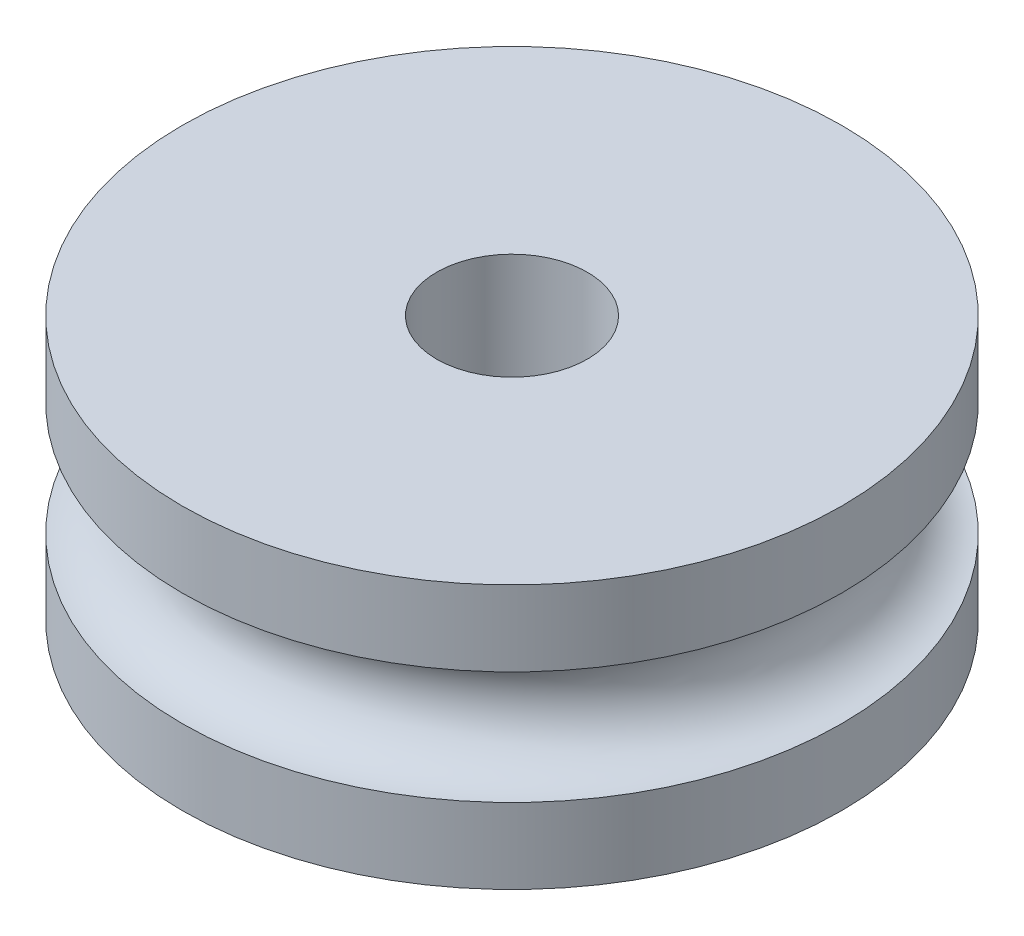
ISO-10303-21;
HEADER;
FILE_DESCRIPTION(('STEP AP214'),'2;1');
FILE_NAME('part.step','',(''),(''),'','','');
FILE_SCHEMA(('AUTOMOTIVE_DESIGN { 1 0 10303 214 1 1 1 1 }'));
ENDSEC;
DATA;
#1=APPLICATION_CONTEXT('core data for automotive mechanical design processes');
#2=APPLICATION_PROTOCOL_DEFINITION('international standard','automotive_design',2000,#1);
#3=PRODUCT_CONTEXT('',#1,'mechanical');
#4=PRODUCT('Part','Part','',(#3));
#5=PRODUCT_RELATED_PRODUCT_CATEGORY('part','',(#4));
#6=PRODUCT_DEFINITION_FORMATION('','',#4);
#7=PRODUCT_DEFINITION_CONTEXT('part definition',#1,'design');
#8=PRODUCT_DEFINITION('design','',#6,#7);
#9=PRODUCT_DEFINITION_SHAPE('','',#8);
#10=(LENGTH_UNIT() NAMED_UNIT(*) SI_UNIT(.MILLI.,.METRE.));
#11=(NAMED_UNIT(*) PLANE_ANGLE_UNIT() SI_UNIT($,.RADIAN.));
#12=(NAMED_UNIT(*) SI_UNIT($,.STERADIAN.) SOLID_ANGLE_UNIT());
#13=UNCERTAINTY_MEASURE_WITH_UNIT(LENGTH_MEASURE(1.E-05),#10,'distance_accuracy_value','');
#14=(GEOMETRIC_REPRESENTATION_CONTEXT(3) GLOBAL_UNCERTAINTY_ASSIGNED_CONTEXT((#13)) GLOBAL_UNIT_ASSIGNED_CONTEXT((#10,
#11,#12)) REPRESENTATION_CONTEXT('',''));
#15=CARTESIAN_POINT('',(0.,0.,0.));
#16=DIRECTION('',(0.,0.,1.));
#17=DIRECTION('',(1.,0.,0.));
#18=AXIS2_PLACEMENT_3D('',#15,#16,#17);
#19=CARTESIAN_POINT('',(0.,7.,0.));
#20=DIRECTION('',(0.,1.,0.));
#21=DIRECTION('',(0.,0.,1.));
#22=AXIS2_PLACEMENT_3D('',#19,#20,#21);
#23=CYLINDRICAL_SURFACE('',#22,17.5);
#24=CARTESIAN_POINT('',(0.,3.,0.));
#25=DIRECTION('',(0.,1.,0.));
#26=DIRECTION('',(0.,0.,1.));
#27=AXIS2_PLACEMENT_3D('',#24,#25,#26);
#28=CIRCLE('',#27,17.5);
#29=CARTESIAN_POINT('',(0.,3.,17.5));
#30=VERTEX_POINT('',#29);
#31=EDGE_CURVE('E10',#30,#30,#28,.T.);
#32=ORIENTED_EDGE('',*,*,#31,.T.);
#33=EDGE_LOOP('',(#32));
#34=FACE_BOUND('',#33,.T.);
#35=CARTESIAN_POINT('',(0.,7.,0.));
#36=DIRECTION('',(0.,1.,0.));
#37=DIRECTION('',(0.,0.,1.));
#38=AXIS2_PLACEMENT_3D('',#35,#36,#37);
#39=CIRCLE('',#38,17.5);
#40=CARTESIAN_POINT('',(0.,7.,17.5));
#41=VERTEX_POINT('',#40);
#42=EDGE_CURVE('E55',#41,#41,#39,.T.);
#43=ORIENTED_EDGE('',*,*,#42,.F.);
#44=EDGE_LOOP('',(#43));
#45=FACE_BOUND('',#44,.T.);
#46=ADVANCED_FACE('F33',(#34,#45),#23,.T.);
#47=CARTESIAN_POINT('',(0.,0.,0.));
#48=DIRECTION('',(0.,1.,0.));
#49=DIRECTION('',(0.,0.,1.));
#50=AXIS2_PLACEMENT_3D('',#47,#48,#49);
#51=TOROIDAL_SURFACE('',#50,17.5,3.);
#52=CARTESIAN_POINT('',(0.,-3.,0.));
#53=DIRECTION('',(0.,1.,0.));
#54=DIRECTION('',(0.,0.,1.));
#55=AXIS2_PLACEMENT_3D('',#52,#53,#54);
#56=CIRCLE('',#55,17.5);
#57=CARTESIAN_POINT('',(0.,-3.,17.5));
#58=VERTEX_POINT('',#57);
#59=EDGE_CURVE('E39',#58,#58,#56,.T.);
#60=ORIENTED_EDGE('',*,*,#59,.T.);
#61=EDGE_LOOP('',(#60));
#62=FACE_BOUND('',#61,.T.);
#63=ORIENTED_EDGE('',*,*,#31,.F.);
#64=EDGE_LOOP('',(#63));
#65=FACE_BOUND('',#64,.T.);
#66=ADVANCED_FACE('F62',(#62,#65),#51,.F.);
#67=CARTESIAN_POINT('',(0.,7.,0.));
#68=DIRECTION('',(0.,1.,0.));
#69=DIRECTION('',(0.,0.,1.));
#70=AXIS2_PLACEMENT_3D('',#67,#68,#69);
#71=CYLINDRICAL_SURFACE('',#70,17.5);
#72=ORIENTED_EDGE('',*,*,#59,.F.);
#73=EDGE_LOOP('',(#72));
#74=FACE_BOUND('',#73,.T.);
#75=CARTESIAN_POINT('',(0.,-7.,0.));
#76=DIRECTION('',(0.,1.,0.));
#77=DIRECTION('',(0.,0.,1.));
#78=AXIS2_PLACEMENT_3D('',#75,#76,#77);
#79=CIRCLE('',#78,17.5);
#80=CARTESIAN_POINT('',(0.,-7.,17.5));
#81=VERTEX_POINT('',#80);
#82=EDGE_CURVE('E43',#81,#81,#79,.T.);
#83=ORIENTED_EDGE('',*,*,#82,.T.);
#84=EDGE_LOOP('',(#83));
#85=FACE_BOUND('',#84,.T.);
#86=ADVANCED_FACE('F66',(#74,#85),#71,.T.);
#87=CARTESIAN_POINT('',(0.,-7.,0.));
#88=DIRECTION('',(0.,-1.,0.));
#89=DIRECTION('',(0.,0.,-1.));
#90=AXIS2_PLACEMENT_3D('',#87,#88,#89);
#91=PLANE('',#90);
#92=CARTESIAN_POINT('',(0.,-7.,0.));
#93=DIRECTION('',(0.,1.,0.));
#94=DIRECTION('',(0.,0.,1.));
#95=AXIS2_PLACEMENT_3D('',#92,#93,#94);
#96=CIRCLE('',#95,4.);
#97=CARTESIAN_POINT('',(0.,-7.,4.));
#98=VERTEX_POINT('',#97);
#99=EDGE_CURVE('E47',#98,#98,#96,.T.);
#100=ORIENTED_EDGE('',*,*,#99,.T.);
#101=EDGE_LOOP('',(#100));
#102=FACE_BOUND('',#101,.T.);
#103=ORIENTED_EDGE('',*,*,#82,.F.);
#104=EDGE_LOOP('',(#103));
#105=FACE_BOUND('',#104,.T.);
#106=ADVANCED_FACE('F70',(#102,#105),#91,.T.);
#107=CARTESIAN_POINT('',(0.,7.,0.));
#108=DIRECTION('',(0.,1.,0.));
#109=DIRECTION('',(0.,0.,1.));
#110=AXIS2_PLACEMENT_3D('',#107,#108,#109);
#111=CYLINDRICAL_SURFACE('',#110,4.);
#112=ORIENTED_EDGE('',*,*,#99,.F.);
#113=EDGE_LOOP('',(#112));
#114=FACE_BOUND('',#113,.T.);
#115=CARTESIAN_POINT('',(0.,7.,0.));
#116=DIRECTION('',(0.,1.,0.));
#117=DIRECTION('',(0.,0.,1.));
#118=AXIS2_PLACEMENT_3D('',#115,#116,#117);
#119=CIRCLE('',#118,4.);
#120=CARTESIAN_POINT('',(0.,7.,4.));
#121=VERTEX_POINT('',#120);
#122=EDGE_CURVE('E52',#121,#121,#119,.T.);
#123=ORIENTED_EDGE('',*,*,#122,.T.);
#124=EDGE_LOOP('',(#123));
#125=FACE_BOUND('',#124,.T.);
#126=ADVANCED_FACE('F77',(#114,#125),#111,.F.);
#127=CARTESIAN_POINT('',(0.,7.,0.));
#128=DIRECTION('',(0.,-1.,0.));
#129=DIRECTION('',(0.,0.,-1.));
#130=AXIS2_PLACEMENT_3D('',#127,#128,#129);
#131=PLANE('',#130);
#132=ORIENTED_EDGE('',*,*,#122,.F.);
#133=EDGE_LOOP('',(#132));
#134=FACE_BOUND('',#133,.T.);
#135=ORIENTED_EDGE('',*,*,#42,.T.);
#136=EDGE_LOOP('',(#135));
#137=FACE_BOUND('',#136,.T.);
#138=ADVANCED_FACE('F59',(#134,#137),#131,.F.);
#139=CLOSED_SHELL('',(#46,#66,#86,#106,#126,#138));
#140=MANIFOLD_SOLID_BREP('B2',#139);
#141=ADVANCED_BREP_SHAPE_REPRESENTATION('',(#18,#140),#14);
#142=SHAPE_DEFINITION_REPRESENTATION(#9,#141);
ENDSEC;
END-ISO-10303-21;
